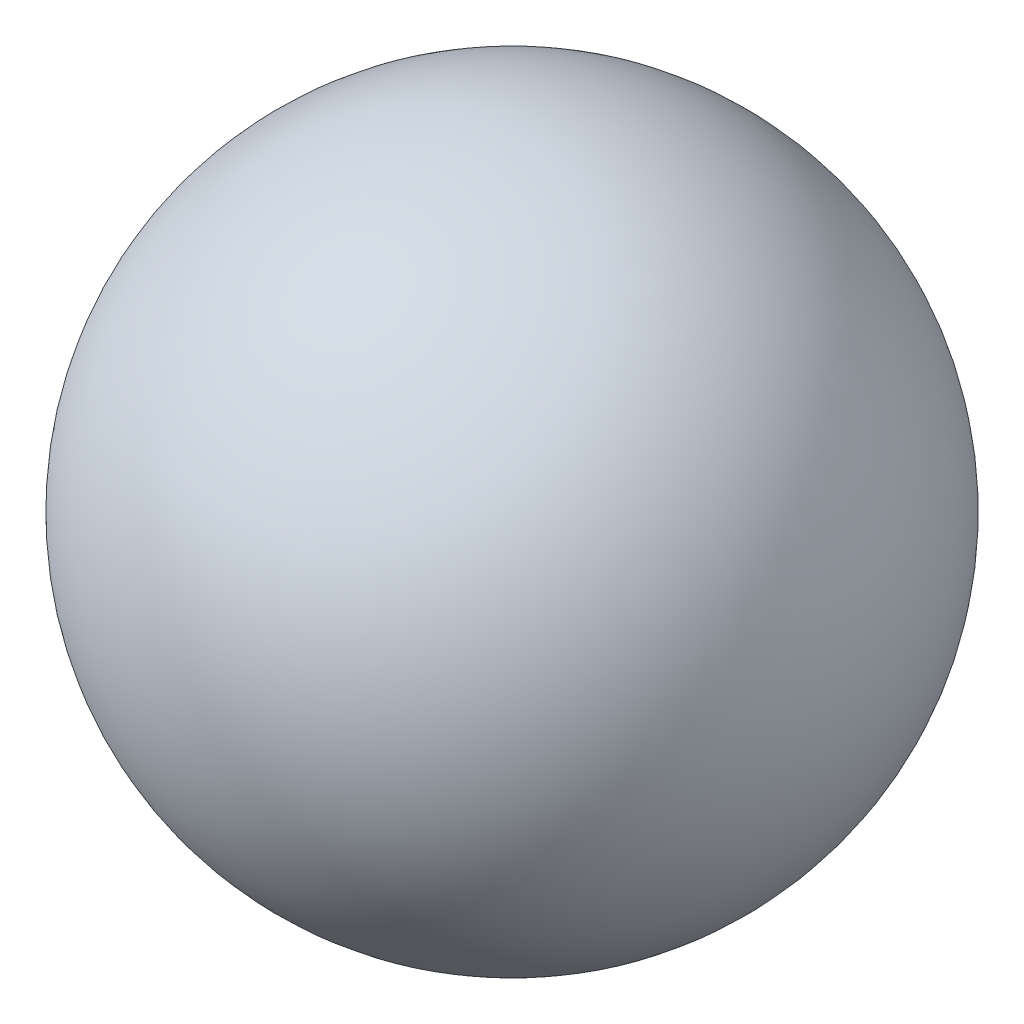
ISO-10303-21;
HEADER;
FILE_DESCRIPTION(('STEP AP214'),'2;1');
FILE_NAME('part.step','',(''),(''),'','','');
FILE_SCHEMA(('AUTOMOTIVE_DESIGN { 1 0 10303 214 1 1 1 1 }'));
ENDSEC;
DATA;
#1=APPLICATION_CONTEXT('core data for automotive mechanical design processes');
#2=APPLICATION_PROTOCOL_DEFINITION('international standard','automotive_design',2000,#1);
#3=PRODUCT_CONTEXT('',#1,'mechanical');
#4=PRODUCT('Part','Part','',(#3));
#5=PRODUCT_RELATED_PRODUCT_CATEGORY('part','',(#4));
#6=PRODUCT_DEFINITION_FORMATION('','',#4);
#7=PRODUCT_DEFINITION_CONTEXT('part definition',#1,'design');
#8=PRODUCT_DEFINITION('design','',#6,#7);
#9=PRODUCT_DEFINITION_SHAPE('','',#8);
#10=(LENGTH_UNIT() NAMED_UNIT(*) SI_UNIT(.MILLI.,.METRE.));
#11=(NAMED_UNIT(*) PLANE_ANGLE_UNIT() SI_UNIT($,.RADIAN.));
#12=(NAMED_UNIT(*) SI_UNIT($,.STERADIAN.) SOLID_ANGLE_UNIT());
#13=UNCERTAINTY_MEASURE_WITH_UNIT(LENGTH_MEASURE(1.E-05),#10,'distance_accuracy_value','');
#14=(GEOMETRIC_REPRESENTATION_CONTEXT(3) GLOBAL_UNCERTAINTY_ASSIGNED_CONTEXT((#13)) GLOBAL_UNIT_ASSIGNED_CONTEXT((#10,
#11,#12)) REPRESENTATION_CONTEXT('',''));
#15=CARTESIAN_POINT('',(0.,0.,0.));
#16=DIRECTION('',(0.,0.,1.));
#17=DIRECTION('',(1.,0.,0.));
#18=AXIS2_PLACEMENT_3D('',#15,#16,#17);
#19=CARTESIAN_POINT('',(0.,0.,0.));
#20=DIRECTION('',(0.,1.,0.));
#21=DIRECTION('',(1.,0.,0.));
#22=AXIS2_PLACEMENT_3D('',#19,#20,#21);
#23=SPHERICAL_SURFACE('',#22,2.25);
#24=CARTESIAN_POINT('',(0.,2.25,0.));
#25=VERTEX_POINT('',#24);
#26=VERTEX_LOOP('',#25);
#27=FACE_BOUND('',#26,.T.);
#28=ADVANCED_FACE('F31',(#27),#23,.T.);
#29=CLOSED_SHELL('',(#28));
#30=MANIFOLD_SOLID_BREP('B2',#29);
#31=ADVANCED_BREP_SHAPE_REPRESENTATION('',(#18,#30),#14);
#32=SHAPE_DEFINITION_REPRESENTATION(#9,#31);
ENDSEC;
END-ISO-10303-21;
